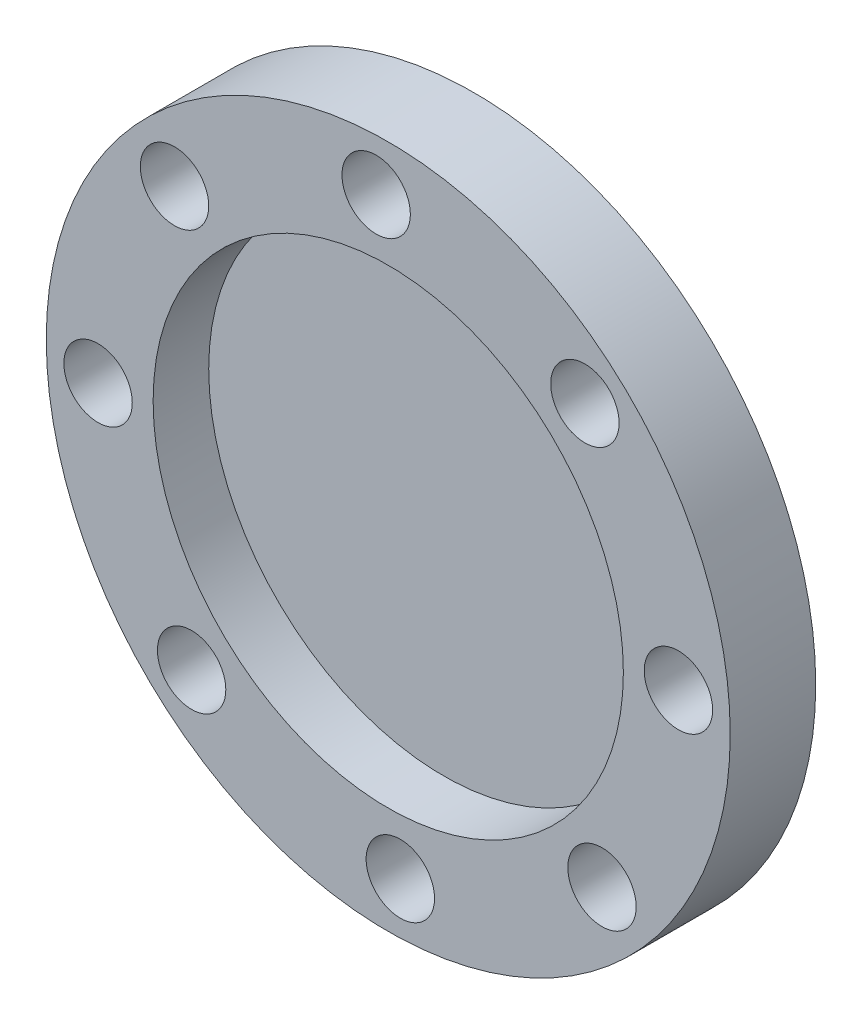
ISO-10303-21;
HEADER;
FILE_DESCRIPTION(('STEP AP214'),'2;1');
FILE_NAME('part.step','',(''),(''),'','','');
FILE_SCHEMA(('AUTOMOTIVE_DESIGN { 1 0 10303 214 1 1 1 1 }'));
ENDSEC;
DATA;
#1=APPLICATION_CONTEXT('core data for automotive mechanical design processes');
#2=APPLICATION_PROTOCOL_DEFINITION('international standard','automotive_design',2000,#1);
#3=PRODUCT_CONTEXT('',#1,'mechanical');
#4=PRODUCT('Part','Part','',(#3));
#5=PRODUCT_RELATED_PRODUCT_CATEGORY('part','',(#4));
#6=PRODUCT_DEFINITION_FORMATION('','',#4);
#7=PRODUCT_DEFINITION_CONTEXT('part definition',#1,'design');
#8=PRODUCT_DEFINITION('design','',#6,#7);
#9=PRODUCT_DEFINITION_SHAPE('','',#8);
#10=(LENGTH_UNIT() NAMED_UNIT(*) SI_UNIT(.MILLI.,.METRE.));
#11=(NAMED_UNIT(*) PLANE_ANGLE_UNIT() SI_UNIT($,.RADIAN.));
#12=(NAMED_UNIT(*) SI_UNIT($,.STERADIAN.) SOLID_ANGLE_UNIT());
#13=UNCERTAINTY_MEASURE_WITH_UNIT(LENGTH_MEASURE(1.E-05),#10,'distance_accuracy_value','');
#14=(GEOMETRIC_REPRESENTATION_CONTEXT(3) GLOBAL_UNCERTAINTY_ASSIGNED_CONTEXT((#13)) GLOBAL_UNIT_ASSIGNED_CONTEXT((#10,
#11,#12)) REPRESENTATION_CONTEXT('',''));
#15=CARTESIAN_POINT('',(0.,0.,0.));
#16=DIRECTION('',(0.,0.,1.));
#17=DIRECTION('',(1.,0.,0.));
#18=AXIS2_PLACEMENT_3D('',#15,#16,#17);
#19=CARTESIAN_POINT('',(0.,0.,10.));
#20=DIRECTION('',(0.,0.,-1.));
#21=DIRECTION('',(-1.,0.,0.));
#22=AXIS2_PLACEMENT_3D('',#19,#20,#21);
#23=CYLINDRICAL_SURFACE('',#22,39.9999999999991);
#24=CARTESIAN_POINT('',(0.,0.,10.));
#25=DIRECTION('',(0.,0.,1.));
#26=DIRECTION('',(1.,0.,0.));
#27=AXIS2_PLACEMENT_3D('',#24,#25,#26);
#28=CIRCLE('',#27,39.9999999999991);
#29=CARTESIAN_POINT('',(39.9999999999991,0.,10.));
#30=VERTEX_POINT('',#29);
#31=EDGE_CURVE('E11',#30,#30,#28,.T.);
#32=ORIENTED_EDGE('',*,*,#31,.F.);
#33=EDGE_LOOP('',(#32));
#34=FACE_BOUND('',#33,.T.);
#35=CARTESIAN_POINT('',(0.,0.,0.));
#36=DIRECTION('',(0.,0.,1.));
#37=DIRECTION('',(1.,0.,0.));
#38=AXIS2_PLACEMENT_3D('',#35,#36,#37);
#39=CIRCLE('',#38,39.9999999999991);
#40=CARTESIAN_POINT('',(39.9999999999991,0.,0.));
#41=VERTEX_POINT('',#40);
#42=EDGE_CURVE('E46',#41,#41,#39,.T.);
#43=ORIENTED_EDGE('',*,*,#42,.T.);
#44=EDGE_LOOP('',(#43));
#45=FACE_BOUND('',#44,.T.);
#46=ADVANCED_FACE('F43',(#34,#45),#23,.T.);
#47=CARTESIAN_POINT('',(0.,0.,10.));
#48=DIRECTION('',(0.,0.,1.));
#49=DIRECTION('',(1.,0.,0.));
#50=AXIS2_PLACEMENT_3D('',#47,#48,#49);
#51=PLANE('',#50);
#52=CARTESIAN_POINT('',(33.9411254969567,1.41421356237977,10.));
#53=DIRECTION('',(0.,0.,1.));
#54=DIRECTION('',(1.,0.,0.));
#55=AXIS2_PLACEMENT_3D('',#52,#53,#54);
#56=CIRCLE('',#55,4.00000000000719);
#57=CARTESIAN_POINT('',(37.9411254969639,1.41421356237977,10.));
#58=VERTEX_POINT('',#57);
#59=EDGE_CURVE('E64',#58,#58,#56,.T.);
#60=ORIENTED_EDGE('',*,*,#59,.F.);
#61=EDGE_LOOP('',(#60));
#62=FACE_BOUND('',#61,.T.);
#63=CARTESIAN_POINT('',(25.0000000000052,-22.9999999999943,10.));
#64=DIRECTION('',(0.,0.,1.));
#65=DIRECTION('',(1.,0.,0.));
#66=AXIS2_PLACEMENT_3D('',#63,#64,#65);
#67=CIRCLE('',#66,4.00000000000683);
#68=CARTESIAN_POINT('',(29.000000000012,-22.9999999999943,10.));
#69=VERTEX_POINT('',#68);
#70=EDGE_CURVE('E83',#69,#69,#67,.T.);
#71=ORIENTED_EDGE('',*,*,#70,.F.);
#72=EDGE_LOOP('',(#71));
#73=FACE_BOUND('',#72,.T.);
#74=CARTESIAN_POINT('',(1.41421356237954,-33.9411254969513,10.));
#75=DIRECTION('',(0.,0.,1.));
#76=DIRECTION('',(1.,0.,0.));
#77=AXIS2_PLACEMENT_3D('',#74,#75,#76);
#78=CIRCLE('',#77,4.00000000000454);
#79=CARTESIAN_POINT('',(5.41421356238408,-33.9411254969513,10.));
#80=VERTEX_POINT('',#79);
#81=EDGE_CURVE('E77',#80,#80,#78,.T.);
#82=ORIENTED_EDGE('',*,*,#81,.F.);
#83=EDGE_LOOP('',(#82));
#84=FACE_BOUND('',#83,.T.);
#85=CARTESIAN_POINT('',(-22.9999999999946,-24.9999999999998,10.));
#86=DIRECTION('',(0.,0.,1.));
#87=DIRECTION('',(1.,0.,0.));
#88=AXIS2_PLACEMENT_3D('',#85,#86,#87);
#89=CIRCLE('',#88,4.00000000000168);
#90=CARTESIAN_POINT('',(-18.9999999999929,-24.9999999999998,10.));
#91=VERTEX_POINT('',#90);
#92=EDGE_CURVE('E70',#91,#91,#89,.T.);
#93=ORIENTED_EDGE('',*,*,#92,.F.);
#94=EDGE_LOOP('',(#93));
#95=FACE_BOUND('',#94,.T.);
#96=CARTESIAN_POINT('',(-33.9411254969515,-1.41421356237411,10.));
#97=DIRECTION('',(0.,0.,1.));
#98=DIRECTION('',(1.,0.,0.));
#99=AXIS2_PLACEMENT_3D('',#96,#97,#98);
#100=CIRCLE('',#99,3.99999999999996);
#101=CARTESIAN_POINT('',(-29.9411254969516,-1.41421356237411,10.));
#102=VERTEX_POINT('',#101);
#103=EDGE_CURVE('E71',#102,#102,#100,.T.);
#104=ORIENTED_EDGE('',*,*,#103,.F.);
#105=EDGE_LOOP('',(#104));
#106=FACE_BOUND('',#105,.T.);
#107=CARTESIAN_POINT('',(-25.,23.,10.));
#108=DIRECTION('',(0.,0.,1.));
#109=DIRECTION('',(1.,0.,0.));
#110=AXIS2_PLACEMENT_3D('',#107,#108,#109);
#111=CIRCLE('',#110,4.);
#112=CARTESIAN_POINT('',(-21.,23.,10.));
#113=VERTEX_POINT('',#112);
#114=EDGE_CURVE('E100',#113,#113,#111,.T.);
#115=ORIENTED_EDGE('',*,*,#114,.F.);
#116=EDGE_LOOP('',(#115));
#117=FACE_BOUND('',#116,.T.);
#118=CARTESIAN_POINT('',(-1.41421356237434,33.9411254969569,10.));
#119=DIRECTION('',(0.,0.,1.));
#120=DIRECTION('',(1.,0.,0.));
#121=AXIS2_PLACEMENT_3D('',#118,#119,#120);
#122=CIRCLE('',#121,4.00000000000239);
#123=CARTESIAN_POINT('',(2.58578643762806,33.9411254969569,10.));
#124=VERTEX_POINT('',#123);
#125=EDGE_CURVE('E94',#124,#124,#122,.T.);
#126=ORIENTED_EDGE('',*,*,#125,.F.);
#127=EDGE_LOOP('',(#126));
#128=FACE_BOUND('',#127,.T.);
#129=CARTESIAN_POINT('',(22.9999999999998,25.0000000000054,10.));
#130=DIRECTION('',(0.,0.,1.));
#131=DIRECTION('',(1.,0.,0.));
#132=AXIS2_PLACEMENT_3D('',#129,#130,#131);
#133=CIRCLE('',#132,4.00000000000536);
#134=CARTESIAN_POINT('',(27.0000000000051,25.0000000000054,10.));
#135=VERTEX_POINT('',#134);
#136=EDGE_CURVE('E61',#135,#135,#133,.T.);
#137=ORIENTED_EDGE('',*,*,#136,.F.);
#138=EDGE_LOOP('',(#137));
#139=FACE_BOUND('',#138,.T.);
#140=CARTESIAN_POINT('',(0.,0.,10.));
#141=DIRECTION('',(0.,0.,1.));
#142=DIRECTION('',(1.,0.,0.));
#143=AXIS2_PLACEMENT_3D('',#140,#141,#142);
#144=CIRCLE('',#143,27.5);
#145=CARTESIAN_POINT('',(27.5,0.,10.));
#146=VERTEX_POINT('',#145);
#147=EDGE_CURVE('E55',#146,#146,#144,.T.);
#148=ORIENTED_EDGE('',*,*,#147,.F.);
#149=EDGE_LOOP('',(#148));
#150=FACE_BOUND('',#149,.T.);
#151=ORIENTED_EDGE('',*,*,#31,.T.);
#152=EDGE_LOOP('',(#151));
#153=FACE_BOUND('',#152,.T.);
#154=ADVANCED_FACE('F111',(#62,#73,#84,#95,#106,#117,#128,#139,#150,#153),#51,.T.);
#155=CARTESIAN_POINT('',(0.,0.,0.));
#156=DIRECTION('',(0.,0.,1.));
#157=DIRECTION('',(1.,0.,0.));
#158=AXIS2_PLACEMENT_3D('',#155,#156,#157);
#159=PLANE('',#158);
#160=CARTESIAN_POINT('',(33.9411254969567,1.41421356237977,0.));
#161=DIRECTION('',(0.,0.,1.));
#162=DIRECTION('',(1.,0.,0.));
#163=AXIS2_PLACEMENT_3D('',#160,#161,#162);
#164=CIRCLE('',#163,4.00000000000719);
#165=CARTESIAN_POINT('',(37.9411254969639,1.41421356237977,0.));
#166=VERTEX_POINT('',#165);
#167=EDGE_CURVE('E86',#166,#166,#164,.T.);
#168=ORIENTED_EDGE('',*,*,#167,.T.);
#169=EDGE_LOOP('',(#168));
#170=FACE_BOUND('',#169,.T.);
#171=CARTESIAN_POINT('',(25.0000000000052,-22.9999999999943,0.));
#172=DIRECTION('',(0.,0.,1.));
#173=DIRECTION('',(1.,0.,0.));
#174=AXIS2_PLACEMENT_3D('',#171,#172,#173);
#175=CIRCLE('',#174,4.00000000000683);
#176=CARTESIAN_POINT('',(29.000000000012,-22.9999999999943,0.));
#177=VERTEX_POINT('',#176);
#178=EDGE_CURVE('E80',#177,#177,#175,.T.);
#179=ORIENTED_EDGE('',*,*,#178,.T.);
#180=EDGE_LOOP('',(#179));
#181=FACE_BOUND('',#180,.T.);
#182=CARTESIAN_POINT('',(1.41421356237954,-33.9411254969513,0.));
#183=DIRECTION('',(0.,0.,1.));
#184=DIRECTION('',(1.,0.,0.));
#185=AXIS2_PLACEMENT_3D('',#182,#183,#184);
#186=CIRCLE('',#185,4.00000000000454);
#187=CARTESIAN_POINT('',(5.41421356238408,-33.9411254969513,0.));
#188=VERTEX_POINT('',#187);
#189=EDGE_CURVE('E74',#188,#188,#186,.T.);
#190=ORIENTED_EDGE('',*,*,#189,.T.);
#191=EDGE_LOOP('',(#190));
#192=FACE_BOUND('',#191,.T.);
#193=CARTESIAN_POINT('',(-22.9999999999946,-24.9999999999998,0.));
#194=DIRECTION('',(0.,0.,1.));
#195=DIRECTION('',(1.,0.,0.));
#196=AXIS2_PLACEMENT_3D('',#193,#194,#195);
#197=CIRCLE('',#196,4.00000000000168);
#198=CARTESIAN_POINT('',(-18.9999999999929,-24.9999999999998,0.));
#199=VERTEX_POINT('',#198);
#200=EDGE_CURVE('E67',#199,#199,#197,.T.);
#201=ORIENTED_EDGE('',*,*,#200,.T.);
#202=EDGE_LOOP('',(#201));
#203=FACE_BOUND('',#202,.T.);
#204=CARTESIAN_POINT('',(-33.9411254969515,-1.41421356237411,0.));
#205=DIRECTION('',(0.,0.,1.));
#206=DIRECTION('',(1.,0.,0.));
#207=AXIS2_PLACEMENT_3D('',#204,#205,#206);
#208=CIRCLE('',#207,3.99999999999996);
#209=CARTESIAN_POINT('',(-29.9411254969516,-1.41421356237411,0.));
#210=VERTEX_POINT('',#209);
#211=EDGE_CURVE('E103',#210,#210,#208,.T.);
#212=ORIENTED_EDGE('',*,*,#211,.T.);
#213=EDGE_LOOP('',(#212));
#214=FACE_BOUND('',#213,.T.);
#215=CARTESIAN_POINT('',(-25.,23.,0.));
#216=DIRECTION('',(0.,0.,1.));
#217=DIRECTION('',(1.,0.,0.));
#218=AXIS2_PLACEMENT_3D('',#215,#216,#217);
#219=CIRCLE('',#218,4.);
#220=CARTESIAN_POINT('',(-21.,23.,0.));
#221=VERTEX_POINT('',#220);
#222=EDGE_CURVE('E97',#221,#221,#219,.T.);
#223=ORIENTED_EDGE('',*,*,#222,.T.);
#224=EDGE_LOOP('',(#223));
#225=FACE_BOUND('',#224,.T.);
#226=CARTESIAN_POINT('',(-1.41421356237434,33.9411254969569,0.));
#227=DIRECTION('',(0.,0.,1.));
#228=DIRECTION('',(1.,0.,0.));
#229=AXIS2_PLACEMENT_3D('',#226,#227,#228);
#230=CIRCLE('',#229,4.00000000000239);
#231=CARTESIAN_POINT('',(2.58578643762806,33.9411254969569,0.));
#232=VERTEX_POINT('',#231);
#233=EDGE_CURVE('E91',#232,#232,#230,.T.);
#234=ORIENTED_EDGE('',*,*,#233,.T.);
#235=EDGE_LOOP('',(#234));
#236=FACE_BOUND('',#235,.T.);
#237=CARTESIAN_POINT('',(22.9999999999998,25.0000000000054,0.));
#238=DIRECTION('',(0.,0.,1.));
#239=DIRECTION('',(1.,0.,0.));
#240=AXIS2_PLACEMENT_3D('',#237,#238,#239);
#241=CIRCLE('',#240,4.00000000000536);
#242=CARTESIAN_POINT('',(27.0000000000051,25.0000000000054,0.));
#243=VERTEX_POINT('',#242);
#244=EDGE_CURVE('E58',#243,#243,#241,.T.);
#245=ORIENTED_EDGE('',*,*,#244,.T.);
#246=EDGE_LOOP('',(#245));
#247=FACE_BOUND('',#246,.T.);
#248=ORIENTED_EDGE('',*,*,#42,.F.);
#249=EDGE_LOOP('',(#248));
#250=FACE_BOUND('',#249,.T.);
#251=ADVANCED_FACE('F114',(#170,#181,#192,#203,#214,#225,#236,#247,#250),#159,.F.);
#252=CARTESIAN_POINT('',(0.,0.,3.5));
#253=DIRECTION('',(0.,0.,1.));
#254=DIRECTION('',(1.,0.,0.));
#255=AXIS2_PLACEMENT_3D('',#252,#253,#254);
#256=CYLINDRICAL_SURFACE('',#255,27.5);
#257=CARTESIAN_POINT('',(0.,0.,3.5));
#258=DIRECTION('',(0.,0.,1.));
#259=DIRECTION('',(1.,0.,0.));
#260=AXIS2_PLACEMENT_3D('',#257,#258,#259);
#261=CIRCLE('',#260,27.5);
#262=CARTESIAN_POINT('',(27.5,0.,3.5));
#263=VERTEX_POINT('',#262);
#264=EDGE_CURVE('E53',#263,#263,#261,.T.);
#265=CARTESIAN_POINT('',(27.5,0.,3.5));
#266=CARTESIAN_POINT('',(27.5,0.,3.56770833333333));
#267=CARTESIAN_POINT('',(27.5,0.,3.63541666666667));
#268=CARTESIAN_POINT('',(27.5,0.,3.77083333333333));
#269=CARTESIAN_POINT('',(27.5,0.,3.83854166666667));
#270=CARTESIAN_POINT('',(27.5,0.,3.97395833333333));
#271=CARTESIAN_POINT('',(27.5,0.,4.04166666666667));
#272=CARTESIAN_POINT('',(27.5,0.,4.17708333333333));
#273=CARTESIAN_POINT('',(27.5,0.,4.24479166666667));
#274=CARTESIAN_POINT('',(27.5,0.,4.38020833333333));
#275=CARTESIAN_POINT('',(27.5,0.,4.44791666666667));
#276=CARTESIAN_POINT('',(27.5,0.,4.58333333333333));
#277=CARTESIAN_POINT('',(27.5,0.,4.65104166666667));
#278=CARTESIAN_POINT('',(27.5,0.,4.78645833333333));
#279=CARTESIAN_POINT('',(27.5,0.,4.85416666666667));
#280=CARTESIAN_POINT('',(27.5,0.,4.98958333333333));
#281=CARTESIAN_POINT('',(27.5,0.,5.05729166666667));
#282=CARTESIAN_POINT('',(27.5,0.,5.19270833333333));
#283=CARTESIAN_POINT('',(27.5,0.,5.26041666666667));
#284=CARTESIAN_POINT('',(27.5,0.,5.39583333333333));
#285=CARTESIAN_POINT('',(27.5,0.,5.46354166666667));
#286=CARTESIAN_POINT('',(27.5,0.,5.59895833333333));
#287=CARTESIAN_POINT('',(27.5,0.,5.66666666666667));
#288=CARTESIAN_POINT('',(27.5,0.,5.80208333333333));
#289=CARTESIAN_POINT('',(27.5,0.,5.86979166666667));
#290=CARTESIAN_POINT('',(27.5,0.,6.00520833333333));
#291=CARTESIAN_POINT('',(27.5,0.,6.07291666666667));
#292=CARTESIAN_POINT('',(27.5,0.,6.20833333333333));
#293=CARTESIAN_POINT('',(27.5,0.,6.27604166666667));
#294=CARTESIAN_POINT('',(27.5,0.,6.41145833333333));
#295=CARTESIAN_POINT('',(27.5,0.,6.47916666666667));
#296=CARTESIAN_POINT('',(27.5,0.,6.61458333333333));
#297=CARTESIAN_POINT('',(27.5,0.,6.68229166666667));
#298=CARTESIAN_POINT('',(27.5,0.,6.81770833333333));
#299=CARTESIAN_POINT('',(27.5,0.,6.88541666666667));
#300=CARTESIAN_POINT('',(27.5,0.,7.02083333333333));
#301=CARTESIAN_POINT('',(27.5,0.,7.08854166666667));
#302=CARTESIAN_POINT('',(27.5,0.,7.22395833333333));
#303=CARTESIAN_POINT('',(27.5,0.,7.29166666666667));
#304=CARTESIAN_POINT('',(27.5,0.,7.42708333333333));
#305=CARTESIAN_POINT('',(27.5,0.,7.49479166666667));
#306=CARTESIAN_POINT('',(27.5,0.,7.63020833333333));
#307=CARTESIAN_POINT('',(27.5,0.,7.69791666666667));
#308=CARTESIAN_POINT('',(27.5,0.,7.83333333333333));
#309=CARTESIAN_POINT('',(27.5,0.,7.90104166666667));
#310=CARTESIAN_POINT('',(27.5,0.,8.03645833333333));
#311=CARTESIAN_POINT('',(27.5,0.,8.10416666666667));
#312=CARTESIAN_POINT('',(27.5,0.,8.23958333333333));
#313=CARTESIAN_POINT('',(27.5,0.,8.30729166666667));
#314=CARTESIAN_POINT('',(27.5,0.,8.44270833333333));
#315=CARTESIAN_POINT('',(27.5,0.,8.51041666666667));
#316=CARTESIAN_POINT('',(27.5,0.,8.64583333333333));
#317=CARTESIAN_POINT('',(27.5,0.,8.71354166666667));
#318=CARTESIAN_POINT('',(27.5,0.,8.84895833333333));
#319=CARTESIAN_POINT('',(27.5,0.,8.91666666666667));
#320=CARTESIAN_POINT('',(27.5,0.,9.05208333333333));
#321=CARTESIAN_POINT('',(27.5,0.,9.11979166666667));
#322=CARTESIAN_POINT('',(27.5,0.,9.25520833333333));
#323=CARTESIAN_POINT('',(27.5,0.,9.32291666666667));
#324=CARTESIAN_POINT('',(27.5,0.,9.45833333333333));
#325=CARTESIAN_POINT('',(27.5,0.,9.52604166666667));
#326=CARTESIAN_POINT('',(27.5,0.,9.66145833333333));
#327=CARTESIAN_POINT('',(27.5,0.,9.72916666666667));
#328=CARTESIAN_POINT('',(27.5,0.,9.86458333333333));
#329=CARTESIAN_POINT('',(27.5,0.,9.93229166666667));
#330=CARTESIAN_POINT('',(27.5,0.,10.));
#331=B_SPLINE_CURVE_WITH_KNOTS('',3,(#265,#266,#267,#268,#269,#270,#271,#272,#273,#274,#275,
#276,#277,#278,#279,#280,#281,#282,#283,#284,#285,#286,#287,#288,#289,#290,#291,#292,#293,#294,
#295,#296,#297,#298,#299,#300,#301,#302,#303,#304,#305,#306,#307,#308,#309,#310,#311,#312,#313,
#314,#315,#316,#317,#318,#319,#320,#321,#322,#323,#324,#325,#326,#327,#328,#329,#330),
.UNSPECIFIED.,.F.,.F.,(4,2,2,2,2,2,2,2,2,2,2,2,2,2,2,2,2,2,2,2,2,2,2,2,2,2,2,2,2,2,2,2,4),(0.,
0.203125,0.40625,0.609375,0.8125,1.015625,1.21875,1.421875,1.625,1.828125,2.03125,2.234375,
2.4375,2.640625,2.84375,3.046875,3.25,3.453125,3.65625,3.859375,4.0625,4.265625,4.46875,
4.671875,4.875,5.078125,5.28125,5.484375,5.6875,5.890625,6.09375,6.296875,6.5),.UNSPECIFIED.);
#332=EDGE_CURVE('BSEAM125',#263,#146,#331,.T.);
#333=ORIENTED_EDGE('',*,*,#264,.F.);
#334=ORIENTED_EDGE('',*,*,#147,.T.);
#335=ORIENTED_EDGE('',*,*,#332,.T.);
#336=ORIENTED_EDGE('',*,*,#332,.F.);
#337=EDGE_LOOP('',(#333,#335,#334,#336));
#338=FACE_BOUND('',#337,.T.);
#339=ADVANCED_FACE('F125',(#338),#256,.F.);
#340=CARTESIAN_POINT('',(0.,0.,3.5));
#341=DIRECTION('',(0.,0.,1.));
#342=DIRECTION('',(1.,0.,0.));
#343=AXIS2_PLACEMENT_3D('',#340,#341,#342);
#344=PLANE('',#343);
#345=ORIENTED_EDGE('',*,*,#264,.T.);
#346=EDGE_LOOP('',(#345));
#347=FACE_BOUND('',#346,.T.);
#348=ADVANCED_FACE('F127',(#347),#344,.T.);
#349=CARTESIAN_POINT('',(22.9999999999998,25.0000000000054,0.));
#350=DIRECTION('',(0.,0.,1.));
#351=DIRECTION('',(1.,0.,0.));
#352=AXIS2_PLACEMENT_3D('',#349,#350,#351);
#353=CYLINDRICAL_SURFACE('',#352,4.00000000000536);
#354=ORIENTED_EDGE('',*,*,#244,.F.);
#355=EDGE_LOOP('',(#354));
#356=FACE_BOUND('',#355,.T.);
#357=ORIENTED_EDGE('',*,*,#136,.T.);
#358=EDGE_LOOP('',(#357));
#359=FACE_BOUND('',#358,.T.);
#360=ADVANCED_FACE('F134',(#356,#359),#353,.F.);
#361=CARTESIAN_POINT('',(-1.41421356237434,33.9411254969569,0.));
#362=DIRECTION('',(0.,0.,1.));
#363=DIRECTION('',(1.,0.,0.));
#364=AXIS2_PLACEMENT_3D('',#361,#362,#363);
#365=CYLINDRICAL_SURFACE('',#364,4.00000000000239);
#366=ORIENTED_EDGE('',*,*,#125,.T.);
#367=EDGE_LOOP('',(#366));
#368=FACE_BOUND('',#367,.T.);
#369=ORIENTED_EDGE('',*,*,#233,.F.);
#370=EDGE_LOOP('',(#369));
#371=FACE_BOUND('',#370,.T.);
#372=ADVANCED_FACE('F166',(#368,#371),#365,.F.);
#373=CARTESIAN_POINT('',(-25.,23.,0.));
#374=DIRECTION('',(0.,0.,1.));
#375=DIRECTION('',(1.,0.,0.));
#376=AXIS2_PLACEMENT_3D('',#373,#374,#375);
#377=CYLINDRICAL_SURFACE('',#376,4.);
#378=ORIENTED_EDGE('',*,*,#222,.F.);
#379=EDGE_LOOP('',(#378));
#380=FACE_BOUND('',#379,.T.);
#381=ORIENTED_EDGE('',*,*,#114,.T.);
#382=EDGE_LOOP('',(#381));
#383=FACE_BOUND('',#382,.T.);
#384=ADVANCED_FACE('F179',(#380,#383),#377,.F.);
#385=CARTESIAN_POINT('',(-33.9411254969515,-1.41421356237411,0.));
#386=DIRECTION('',(0.,0.,1.));
#387=DIRECTION('',(1.,0.,0.));
#388=AXIS2_PLACEMENT_3D('',#385,#386,#387);
#389=CYLINDRICAL_SURFACE('',#388,3.99999999999996);
#390=ORIENTED_EDGE('',*,*,#211,.F.);
#391=EDGE_LOOP('',(#390));
#392=FACE_BOUND('',#391,.T.);
#393=ORIENTED_EDGE('',*,*,#103,.T.);
#394=EDGE_LOOP('',(#393));
#395=FACE_BOUND('',#394,.T.);
#396=ADVANCED_FACE('F109',(#392,#395),#389,.F.);
#397=CARTESIAN_POINT('',(-22.9999999999946,-24.9999999999998,0.));
#398=DIRECTION('',(0.,0.,1.));
#399=DIRECTION('',(1.,0.,0.));
#400=AXIS2_PLACEMENT_3D('',#397,#398,#399);
#401=CYLINDRICAL_SURFACE('',#400,4.00000000000168);
#402=ORIENTED_EDGE('',*,*,#200,.F.);
#403=EDGE_LOOP('',(#402));
#404=FACE_BOUND('',#403,.T.);
#405=ORIENTED_EDGE('',*,*,#92,.T.);
#406=EDGE_LOOP('',(#405));
#407=FACE_BOUND('',#406,.T.);
#408=ADVANCED_FACE('F200',(#404,#407),#401,.F.);
#409=CARTESIAN_POINT('',(1.41421356237954,-33.9411254969513,0.));
#410=DIRECTION('',(0.,0.,1.));
#411=DIRECTION('',(1.,0.,0.));
#412=AXIS2_PLACEMENT_3D('',#409,#410,#411);
#413=CYLINDRICAL_SURFACE('',#412,4.00000000000454);
#414=ORIENTED_EDGE('',*,*,#189,.F.);
#415=EDGE_LOOP('',(#414));
#416=FACE_BOUND('',#415,.T.);
#417=ORIENTED_EDGE('',*,*,#81,.T.);
#418=EDGE_LOOP('',(#417));
#419=FACE_BOUND('',#418,.T.);
#420=ADVANCED_FACE('F211',(#416,#419),#413,.F.);
#421=CARTESIAN_POINT('',(25.0000000000052,-22.9999999999943,0.));
#422=DIRECTION('',(0.,0.,1.));
#423=DIRECTION('',(1.,0.,0.));
#424=AXIS2_PLACEMENT_3D('',#421,#422,#423);
#425=CYLINDRICAL_SURFACE('',#424,4.00000000000683);
#426=ORIENTED_EDGE('',*,*,#178,.F.);
#427=EDGE_LOOP('',(#426));
#428=FACE_BOUND('',#427,.T.);
#429=ORIENTED_EDGE('',*,*,#70,.T.);
#430=EDGE_LOOP('',(#429));
#431=FACE_BOUND('',#430,.T.);
#432=ADVANCED_FACE('F222',(#428,#431),#425,.F.);
#433=CARTESIAN_POINT('',(33.9411254969567,1.41421356237977,0.));
#434=DIRECTION('',(0.,0.,1.));
#435=DIRECTION('',(1.,0.,0.));
#436=AXIS2_PLACEMENT_3D('',#433,#434,#435);
#437=CYLINDRICAL_SURFACE('',#436,4.00000000000719);
#438=ORIENTED_EDGE('',*,*,#167,.F.);
#439=EDGE_LOOP('',(#438));
#440=FACE_BOUND('',#439,.T.);
#441=ORIENTED_EDGE('',*,*,#59,.T.);
#442=EDGE_LOOP('',(#441));
#443=FACE_BOUND('',#442,.T.);
#444=ADVANCED_FACE('F233',(#440,#443),#437,.F.);
#445=CLOSED_SHELL('',(#46,#154,#251,#339,#348,#360,#372,#384,#396,#408,#420,#432,#444));
#446=MANIFOLD_SOLID_BREP('B2',#445);
#447=ADVANCED_BREP_SHAPE_REPRESENTATION('',(#18,#446),#14);
#448=SHAPE_DEFINITION_REPRESENTATION(#9,#447);
ENDSEC;
END-ISO-10303-21;
